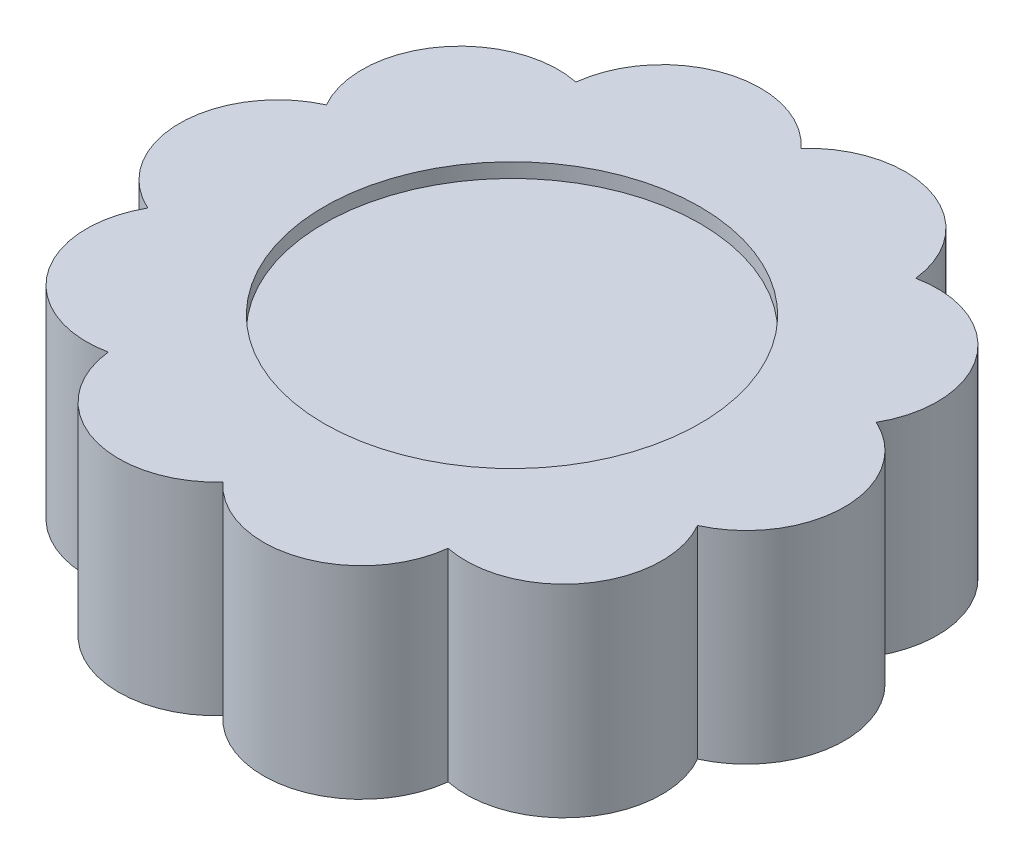
ISO-10303-21;
HEADER;
FILE_DESCRIPTION(('STEP AP214'),'2;1');
FILE_NAME('part.step','',(''),(''),'','','');
FILE_SCHEMA(('AUTOMOTIVE_DESIGN { 1 0 10303 214 1 1 1 1 }'));
ENDSEC;
DATA;
#1=APPLICATION_CONTEXT('core data for automotive mechanical design processes');
#2=APPLICATION_PROTOCOL_DEFINITION('international standard','automotive_design',2000,#1);
#3=PRODUCT_CONTEXT('',#1,'mechanical');
#4=PRODUCT('Part','Part','',(#3));
#5=PRODUCT_RELATED_PRODUCT_CATEGORY('part','',(#4));
#6=PRODUCT_DEFINITION_FORMATION('','',#4);
#7=PRODUCT_DEFINITION_CONTEXT('part definition',#1,'design');
#8=PRODUCT_DEFINITION('design','',#6,#7);
#9=PRODUCT_DEFINITION_SHAPE('','',#8);
#10=(LENGTH_UNIT() NAMED_UNIT(*) SI_UNIT(.MILLI.,.METRE.));
#11=(NAMED_UNIT(*) PLANE_ANGLE_UNIT() SI_UNIT($,.RADIAN.));
#12=(NAMED_UNIT(*) SI_UNIT($,.STERADIAN.) SOLID_ANGLE_UNIT());
#13=UNCERTAINTY_MEASURE_WITH_UNIT(LENGTH_MEASURE(1.E-05),#10,'distance_accuracy_value','');
#14=(GEOMETRIC_REPRESENTATION_CONTEXT(3) GLOBAL_UNCERTAINTY_ASSIGNED_CONTEXT((#13)) GLOBAL_UNIT_ASSIGNED_CONTEXT((#10,
#11,#12)) REPRESENTATION_CONTEXT('',''));
#15=CARTESIAN_POINT('',(0.,0.,0.));
#16=DIRECTION('',(0.,0.,1.));
#17=DIRECTION('',(1.,0.,0.));
#18=AXIS2_PLACEMENT_3D('',#15,#16,#17);
#19=CARTESIAN_POINT('',(0.,20.6421356237309,0.));
#20=DIRECTION('',(0.,-1.,0.));
#21=DIRECTION('',(0.,0.,-1.));
#22=AXIS2_PLACEMENT_3D('',#19,#20,#21);
#23=CYLINDRICAL_SURFACE('',#22,5.);
#24=CARTESIAN_POINT('',(0.,-3.,0.));
#25=DIRECTION('',(0.,-1.,0.));
#26=DIRECTION('',(0.,0.,-1.));
#27=AXIS2_PLACEMENT_3D('',#24,#25,#26);
#28=CIRCLE('',#27,5.);
#29=CARTESIAN_POINT('',(0.,-3.,-5.));
#30=VERTEX_POINT('',#29);
#31=EDGE_CURVE('E260',#30,#30,#28,.T.);
#32=ORIENTED_EDGE('',*,*,#31,.F.);
#33=EDGE_LOOP('',(#32));
#34=FACE_BOUND('',#33,.T.);
#35=CARTESIAN_POINT('',(0.,0.5,0.));
#36=DIRECTION('',(0.,1.,0.));
#37=DIRECTION('',(0.,0.,1.));
#38=AXIS2_PLACEMENT_3D('',#35,#36,#37);
#39=CIRCLE('',#38,5.);
#40=CARTESIAN_POINT('',(0.,0.5,5.));
#41=VERTEX_POINT('',#40);
#42=EDGE_CURVE('E12',#41,#41,#39,.T.);
#43=ORIENTED_EDGE('',*,*,#42,.F.);
#44=EDGE_LOOP('',(#43));
#45=FACE_BOUND('',#44,.T.);
#46=ADVANCED_FACE('F110',(#34,#45),#23,.T.);
#47=CARTESIAN_POINT('',(0.,0.,0.));
#48=DIRECTION('',(0.,1.,0.));
#49=DIRECTION('',(0.,0.,1.));
#50=AXIS2_PLACEMENT_3D('',#47,#48,#49);
#51=PLANE('',#50);
#52=DIRECTION('',(0.,0.,1.));
#53=VECTOR('',#52,1.);
#54=CARTESIAN_POINT('',(-1.6,0.,-2.65518360947035));
#55=LINE('',#54,#53);
#56=CARTESIAN_POINT('',(-1.6,0.,-2.65518360947035));
#57=VERTEX_POINT('',#56);
#58=CARTESIAN_POINT('',(-1.6,0.,2.65518360947035));
#59=VERTEX_POINT('',#58);
#60=EDGE_CURVE('E268',#57,#59,#55,.T.);
#61=ORIENTED_EDGE('',*,*,#60,.T.);
#62=CARTESIAN_POINT('',(0.,0.,0.));
#63=DIRECTION('',(0.,1.,0.));
#64=DIRECTION('',(0.,0.,1.));
#65=AXIS2_PLACEMENT_3D('',#62,#63,#64);
#66=CIRCLE('',#65,3.1);
#67=EDGE_CURVE('E271',#59,#57,#66,.T.);
#68=ORIENTED_EDGE('',*,*,#67,.T.);
#69=EDGE_LOOP('',(#61,#68));
#70=FACE_BOUND('',#69,.T.);
#71=CARTESIAN_POINT('',(0.,0.,0.));
#72=DIRECTION('',(0.,-1.,0.));
#73=DIRECTION('',(0.,0.,-1.));
#74=AXIS2_PLACEMENT_3D('',#71,#72,#73);
#75=CIRCLE('',#74,4.);
#76=CARTESIAN_POINT('',(0.,0.,-4.));
#77=VERTEX_POINT('',#76);
#78=EDGE_CURVE('E252',#77,#77,#75,.T.);
#79=ORIENTED_EDGE('',*,*,#78,.T.);
#80=EDGE_LOOP('',(#79));
#81=FACE_BOUND('',#80,.T.);
#82=ADVANCED_FACE('F289',(#70,#81),#51,.F.);
#83=CARTESIAN_POINT('',(0.,20.6421356237309,0.));
#84=DIRECTION('',(0.,-1.,0.));
#85=DIRECTION('',(0.,0.,-1.));
#86=AXIS2_PLACEMENT_3D('',#83,#84,#85);
#87=CYLINDRICAL_SURFACE('',#86,3.1);
#88=DIRECTION('',(0.,-1.,0.));
#89=VECTOR('',#88,1.);
#90=CARTESIAN_POINT('',(-1.6,20.6421356237309,2.65518360947035));
#91=LINE('',#90,#89);
#92=CARTESIAN_POINT('',(-1.6,6.5,2.65518360947035));
#93=VERTEX_POINT('',#92);
#94=EDGE_CURVE('E274',#93,#59,#91,.T.);
#95=ORIENTED_EDGE('',*,*,#94,.F.);
#96=CARTESIAN_POINT('',(0.,6.5,0.));
#97=DIRECTION('',(0.,1.,0.));
#98=DIRECTION('',(0.,0.,1.));
#99=AXIS2_PLACEMENT_3D('',#96,#97,#98);
#100=CIRCLE('',#99,3.1);
#101=CARTESIAN_POINT('',(-1.6,6.5,-2.65518360947035));
#102=VERTEX_POINT('',#101);
#103=EDGE_CURVE('E117',#93,#102,#100,.T.);
#104=ORIENTED_EDGE('',*,*,#103,.T.);
#105=DIRECTION('',(0.,-1.,0.));
#106=VECTOR('',#105,1.);
#107=CARTESIAN_POINT('',(-1.6,20.6421356237309,-2.65518360947035));
#108=LINE('',#107,#106);
#109=EDGE_CURVE('E276',#102,#57,#108,.T.);
#110=ORIENTED_EDGE('',*,*,#109,.T.);
#111=ORIENTED_EDGE('',*,*,#67,.F.);
#112=EDGE_LOOP('',(#95,#104,#110,#111));
#113=FACE_BOUND('',#112,.T.);
#114=ADVANCED_FACE('F280',(#113),#87,.F.);
#115=CARTESIAN_POINT('',(-1.6,20.6421356237309,-2.65518360947035));
#116=DIRECTION('',(1.,0.,0.));
#117=DIRECTION('',(0.,0.,-1.));
#118=AXIS2_PLACEMENT_3D('',#115,#116,#117);
#119=PLANE('',#118);
#120=ORIENTED_EDGE('',*,*,#109,.F.);
#121=DIRECTION('',(0.,0.,1.));
#122=VECTOR('',#121,1.);
#123=CARTESIAN_POINT('',(-1.6,6.5,-2.65518360947035));
#124=LINE('',#123,#122);
#125=EDGE_CURVE('E265',#102,#93,#124,.T.);
#126=ORIENTED_EDGE('',*,*,#125,.T.);
#127=ORIENTED_EDGE('',*,*,#94,.T.);
#128=ORIENTED_EDGE('',*,*,#60,.F.);
#129=EDGE_LOOP('',(#120,#126,#127,#128));
#130=FACE_BOUND('',#129,.T.);
#131=ADVANCED_FACE('F287',(#130),#119,.T.);
#132=CARTESIAN_POINT('',(0.,-3.,0.));
#133=DIRECTION('',(0.,-1.,0.));
#134=DIRECTION('',(0.,0.,-1.));
#135=AXIS2_PLACEMENT_3D('',#132,#133,#134);
#136=PLANE('',#135);
#137=ORIENTED_EDGE('',*,*,#31,.T.);
#138=EDGE_LOOP('',(#137));
#139=FACE_BOUND('',#138,.T.);
#140=CARTESIAN_POINT('',(0.,-3.,0.));
#141=DIRECTION('',(0.,-1.,0.));
#142=DIRECTION('',(0.,0.,-1.));
#143=AXIS2_PLACEMENT_3D('',#140,#141,#142);
#144=CIRCLE('',#143,4.);
#145=CARTESIAN_POINT('',(0.,-3.,-4.));
#146=VERTEX_POINT('',#145);
#147=EDGE_CURVE('E257',#146,#146,#144,.T.);
#148=ORIENTED_EDGE('',*,*,#147,.F.);
#149=EDGE_LOOP('',(#148));
#150=FACE_BOUND('',#149,.T.);
#151=ADVANCED_FACE('F296',(#139,#150),#136,.T.);
#152=CARTESIAN_POINT('',(0.,-3.,0.));
#153=DIRECTION('',(0.,1.,0.));
#154=DIRECTION('',(0.,0.,1.));
#155=AXIS2_PLACEMENT_3D('',#152,#153,#154);
#156=CYLINDRICAL_SURFACE('',#155,4.);
#157=ORIENTED_EDGE('',*,*,#147,.T.);
#158=EDGE_LOOP('',(#157));
#159=FACE_BOUND('',#158,.T.);
#160=ORIENTED_EDGE('',*,*,#78,.F.);
#161=EDGE_LOOP('',(#160));
#162=FACE_BOUND('',#161,.T.);
#163=ADVANCED_FACE('F294',(#159,#162),#156,.F.);
#164=CARTESIAN_POINT('',(0.,6.5,0.));
#165=DIRECTION('',(0.,1.,0.));
#166=DIRECTION('',(0.,0.,1.));
#167=AXIS2_PLACEMENT_3D('',#164,#165,#166);
#168=PLANE('',#167);
#169=ORIENTED_EDGE('',*,*,#125,.F.);
#170=ORIENTED_EDGE('',*,*,#103,.F.);
#171=EDGE_LOOP('',(#169,#170));
#172=FACE_BOUND('',#171,.T.);
#173=ADVANCED_FACE('F285',(#172),#168,.F.);
#174=CARTESIAN_POINT('',(0.,0.499999999999999,0.));
#175=DIRECTION('',(0.,1.,0.));
#176=DIRECTION('',(0.,0.,1.));
#177=AXIS2_PLACEMENT_3D('',#174,#175,#176);
#178=PLANE('',#177);
#179=ORIENTED_EDGE('',*,*,#42,.T.);
#180=EDGE_LOOP('',(#179));
#181=FACE_BOUND('',#180,.T.);
#182=CARTESIAN_POINT('',(-6.55733919765978,0.499999999999999,4.76418580125281));
#183=DIRECTION('',(0.,1.,0.));
#184=DIRECTION('',(0.,0.,1.));
#185=AXIS2_PLACEMENT_3D('',#182,#183,#184);
#186=CIRCLE('',#185,3.39468299805465);
#187=CARTESIAN_POINT('',(-9.51056516073295,0.499999999999999,3.09016995057758));
#188=VERTEX_POINT('',#187);
#189=CARTESIAN_POINT('',(-5.87785251711638,0.499999999999999,8.09016994796949));
#190=VERTEX_POINT('',#189);
#191=EDGE_CURVE('E218',#188,#190,#186,.T.);
#192=ORIENTED_EDGE('',*,*,#191,.F.);
#193=CARTESIAN_POINT('',(-8.10531700194535,0.499999999999999,2.90956408272036E-09));
#194=DIRECTION('',(0.,1.,0.));
#195=DIRECTION('',(0.,0.,1.));
#196=AXIS2_PLACEMENT_3D('',#193,#194,#195);
#197=CIRCLE('',#196,3.39468299805465);
#198=CARTESIAN_POINT('',(-9.51056516517012,0.499999999999999,-3.09016993692137));
#199=VERTEX_POINT('',#198);
#200=EDGE_CURVE('E211',#199,#188,#197,.T.);
#201=ORIENTED_EDGE('',*,*,#200,.F.);
#202=CARTESIAN_POINT('',(-6.55733920108017,0.499999999999999,-4.76418579654504));
#203=DIRECTION('',(0.,1.,0.));
#204=DIRECTION('',(0.,0.,1.));
#205=AXIS2_PLACEMENT_3D('',#202,#203,#204);
#206=CIRCLE('',#205,3.39468299805465);
#207=CARTESIAN_POINT('',(-5.87785252873305,0.499999999999999,-8.09016993952948));
#208=VERTEX_POINT('',#207);
#209=EDGE_CURVE('E210',#208,#199,#206,.T.);
#210=ORIENTED_EDGE('',*,*,#209,.F.);
#211=CARTESIAN_POINT('',(-2.50468070116444,0.499999999999999,-7.70861455043892));
#212=DIRECTION('',(0.,1.,0.));
#213=DIRECTION('',(0.,0.,1.));
#214=AXIS2_PLACEMENT_3D('',#211,#212,#213);
#215=CIRCLE('',#214,3.39468299805465);
#216=CARTESIAN_POINT('',(0.,0.499999999999999,-10.));
#217=VERTEX_POINT('',#216);
#218=EDGE_CURVE('E332',#217,#208,#215,.T.);
#219=ORIENTED_EDGE('',*,*,#218,.F.);
#220=CARTESIAN_POINT('',(2.50468069563008,0.499999999999999,-7.70861455223715));
#221=DIRECTION('',(0.,1.,0.));
#222=DIRECTION('',(0.,0.,1.));
#223=AXIS2_PLACEMENT_3D('',#220,#221,#222);
#224=CIRCLE('',#223,3.39468299805465);
#225=CARTESIAN_POINT('',(5.87785251711632,0.499999999999999,-8.09016994796953));
#226=VERTEX_POINT('',#225);
#227=EDGE_CURVE('E336',#226,#217,#224,.T.);
#228=ORIENTED_EDGE('',*,*,#227,.F.);
#229=CARTESIAN_POINT('',(6.55733919765975,0.499999999999999,-4.76418580125286));
#230=DIRECTION('',(0.,1.,0.));
#231=DIRECTION('',(0.,0.,1.));
#232=AXIS2_PLACEMENT_3D('',#229,#230,#231);
#233=CIRCLE('',#232,3.39468299805465);
#234=CARTESIAN_POINT('',(9.51056516073293,0.499999999999999,-3.09016995057765));
#235=VERTEX_POINT('',#234);
#236=EDGE_CURVE('E340',#235,#226,#233,.T.);
#237=ORIENTED_EDGE('',*,*,#236,.F.);
#238=CARTESIAN_POINT('',(8.10531700194535,0.499999999999999,-2.90961829282899E-09));
#239=DIRECTION('',(0.,1.,0.));
#240=DIRECTION('',(0.,0.,1.));
#241=AXIS2_PLACEMENT_3D('',#238,#239,#240);
#242=CIRCLE('',#241,3.39468299805465);
#243=CARTESIAN_POINT('',(9.51056516517014,0.499999999999999,3.09016993692131));
#244=VERTEX_POINT('',#243);
#245=EDGE_CURVE('E253',#244,#235,#242,.T.);
#246=ORIENTED_EDGE('',*,*,#245,.F.);
#247=CARTESIAN_POINT('',(6.55733920108021,0.499999999999999,4.764185796545));
#248=DIRECTION('',(0.,1.,0.));
#249=DIRECTION('',(0.,0.,1.));
#250=AXIS2_PLACEMENT_3D('',#247,#248,#249);
#251=CIRCLE('',#250,3.39468299805465);
#252=CARTESIAN_POINT('',(5.87785252873311,0.499999999999999,8.09016993952944));
#253=VERTEX_POINT('',#252);
#254=EDGE_CURVE('E240',#253,#244,#251,.T.);
#255=ORIENTED_EDGE('',*,*,#254,.F.);
#256=CARTESIAN_POINT('',(2.5046807011645,0.499999999999999,7.70861455043891));
#257=DIRECTION('',(0.,1.,0.));
#258=DIRECTION('',(0.,0.,1.));
#259=AXIS2_PLACEMENT_3D('',#256,#257,#258);
#260=CIRCLE('',#259,3.39468299805465);
#261=CARTESIAN_POINT('',(7.17953127504778E-09,0.499999999999999,10.));
#262=VERTEX_POINT('',#261);
#263=EDGE_CURVE('E129',#262,#253,#260,.T.);
#264=ORIENTED_EDGE('',*,*,#263,.F.);
#265=CARTESIAN_POINT('',(-2.50468069563013,0.499999999999999,7.70861455223713));
#266=DIRECTION('',(0.,1.,0.));
#267=DIRECTION('',(0.,0.,1.));
#268=AXIS2_PLACEMENT_3D('',#265,#266,#267);
#269=CIRCLE('',#268,3.39468299805465);
#270=EDGE_CURVE('E124',#190,#262,#269,.T.);
#271=ORIENTED_EDGE('',*,*,#270,.F.);
#272=EDGE_LOOP('',(#192,#201,#210,#219,#228,#237,#246,#255,#264,#271));
#273=FACE_BOUND('',#272,.T.);
#274=ADVANCED_FACE('F303',(#181,#273),#178,.F.);
#275=CARTESIAN_POINT('',(0.,7.5,0.));
#276=DIRECTION('',(0.,1.,0.));
#277=DIRECTION('',(0.,0.,1.));
#278=AXIS2_PLACEMENT_3D('',#275,#276,#277);
#279=PLANE('',#278);
#280=CARTESIAN_POINT('',(0.,7.5,0.));
#281=DIRECTION('',(0.,1.,0.));
#282=DIRECTION('',(0.,0.,1.));
#283=AXIS2_PLACEMENT_3D('',#280,#281,#282);
#284=CIRCLE('',#283,6.5);
#285=CARTESIAN_POINT('',(0.,7.5,6.5));
#286=VERTEX_POINT('',#285);
#287=EDGE_CURVE('E368',#286,#286,#284,.T.);
#288=ORIENTED_EDGE('',*,*,#287,.F.);
#289=EDGE_LOOP('',(#288));
#290=FACE_BOUND('',#289,.T.);
#291=CARTESIAN_POINT('',(8.10531700194535,7.5,-2.90961829282899E-09));
#292=DIRECTION('',(0.,1.,0.));
#293=DIRECTION('',(0.,0.,1.));
#294=AXIS2_PLACEMENT_3D('',#291,#292,#293);
#295=CIRCLE('',#294,3.39468299805465);
#296=CARTESIAN_POINT('',(9.51056516295155,7.5,-3.09016994374945));
#297=VERTEX_POINT('',#296);
#298=CARTESIAN_POINT('',(9.51056516517014,7.5,3.09016993692131));
#299=VERTEX_POINT('',#298);
#300=EDGE_CURVE('E248',#297,#299,#295,.F.);
#301=ORIENTED_EDGE('',*,*,#300,.F.);
#302=CARTESIAN_POINT('',(6.55733919765975,7.5,-4.76418580125286));
#303=DIRECTION('',(0.,1.,0.));
#304=DIRECTION('',(0.,0.,1.));
#305=AXIS2_PLACEMENT_3D('',#302,#303,#304);
#306=CIRCLE('',#305,3.39468299805465);
#307=CARTESIAN_POINT('',(5.87785251711632,7.5,-8.09016994796953));
#308=VERTEX_POINT('',#307);
#309=EDGE_CURVE('E219',#308,#297,#306,.F.);
#310=ORIENTED_EDGE('',*,*,#309,.F.);
#311=CARTESIAN_POINT('',(2.50468069563008,7.5,-7.70861455223715));
#312=DIRECTION('',(0.,-1.,0.));
#313=DIRECTION('',(0.,0.,-1.));
#314=AXIS2_PLACEMENT_3D('',#311,#312,#313);
#315=CIRCLE('',#314,3.39468299805465);
#316=CARTESIAN_POINT('',(0.,7.5,-10.));
#317=VERTEX_POINT('',#316);
#318=EDGE_CURVE('E341',#317,#308,#315,.T.);
#319=ORIENTED_EDGE('',*,*,#318,.F.);
#320=CARTESIAN_POINT('',(-2.50468070116444,7.5,-7.70861455043892));
#321=DIRECTION('',(0.,1.,0.));
#322=DIRECTION('',(0.,0.,1.));
#323=AXIS2_PLACEMENT_3D('',#320,#321,#322);
#324=CIRCLE('',#323,3.39468299805465);
#325=CARTESIAN_POINT('',(-5.87785252873305,7.5,-8.09016993952948));
#326=VERTEX_POINT('',#325);
#327=EDGE_CURVE('E334',#326,#317,#324,.F.);
#328=ORIENTED_EDGE('',*,*,#327,.F.);
#329=CARTESIAN_POINT('',(-6.55733920108017,7.5,-4.76418579654504));
#330=DIRECTION('',(0.,-1.,0.));
#331=DIRECTION('',(0.,0.,-1.));
#332=AXIS2_PLACEMENT_3D('',#329,#330,#331);
#333=CIRCLE('',#332,3.39468299805465);
#334=CARTESIAN_POINT('',(-9.51056516517012,7.5,-3.09016993692137));
#335=VERTEX_POINT('',#334);
#336=EDGE_CURVE('E206',#335,#326,#333,.T.);
#337=ORIENTED_EDGE('',*,*,#336,.F.);
#338=CARTESIAN_POINT('',(-8.10531700194535,7.5,2.90956408272036E-09));
#339=DIRECTION('',(0.,1.,0.));
#340=DIRECTION('',(0.,0.,1.));
#341=AXIS2_PLACEMENT_3D('',#338,#339,#340);
#342=CIRCLE('',#341,3.39468299805465);
#343=CARTESIAN_POINT('',(-9.51056516073295,7.5,3.09016995057758));
#344=VERTEX_POINT('',#343);
#345=EDGE_CURVE('E198',#344,#335,#342,.F.);
#346=ORIENTED_EDGE('',*,*,#345,.F.);
#347=CARTESIAN_POINT('',(-6.55733919765978,7.5,4.76418580125281));
#348=DIRECTION('',(0.,1.,0.));
#349=DIRECTION('',(0.,0.,1.));
#350=AXIS2_PLACEMENT_3D('',#347,#348,#349);
#351=CIRCLE('',#350,3.39468299805465);
#352=CARTESIAN_POINT('',(-5.87785251711638,7.5,8.09016994796949));
#353=VERTEX_POINT('',#352);
#354=EDGE_CURVE('E204',#353,#344,#351,.F.);
#355=ORIENTED_EDGE('',*,*,#354,.F.);
#356=CARTESIAN_POINT('',(-2.50468069563013,7.5,7.70861455223713));
#357=DIRECTION('',(0.,1.,0.));
#358=DIRECTION('',(0.,0.,1.));
#359=AXIS2_PLACEMENT_3D('',#356,#357,#358);
#360=CIRCLE('',#359,3.39468299805465);
#361=CARTESIAN_POINT('',(7.17953127504778E-09,7.5,10.));
#362=VERTEX_POINT('',#361);
#363=EDGE_CURVE('E231',#362,#353,#360,.F.);
#364=ORIENTED_EDGE('',*,*,#363,.F.);
#365=CARTESIAN_POINT('',(2.5046807011645,7.5,7.70861455043891));
#366=DIRECTION('',(0.,1.,0.));
#367=DIRECTION('',(0.,0.,1.));
#368=AXIS2_PLACEMENT_3D('',#365,#366,#367);
#369=CIRCLE('',#368,3.39468299805465);
#370=CARTESIAN_POINT('',(5.87785252873311,7.5,8.09016993952944));
#371=VERTEX_POINT('',#370);
#372=EDGE_CURVE('E237',#371,#362,#369,.F.);
#373=ORIENTED_EDGE('',*,*,#372,.F.);
#374=CARTESIAN_POINT('',(6.55733920108021,7.5,4.764185796545));
#375=DIRECTION('',(0.,1.,0.));
#376=DIRECTION('',(0.,0.,1.));
#377=AXIS2_PLACEMENT_3D('',#374,#375,#376);
#378=CIRCLE('',#377,3.39468299805465);
#379=EDGE_CURVE('E244',#299,#371,#378,.F.);
#380=ORIENTED_EDGE('',*,*,#379,.F.);
#381=EDGE_LOOP('',(#301,#310,#319,#328,#337,#346,#355,#364,#373,#380));
#382=FACE_BOUND('',#381,.T.);
#383=ADVANCED_FACE('F201',(#290,#382),#279,.T.);
#384=CARTESIAN_POINT('',(8.10531700194535,-6.10515619326562,-2.90961829282899E-09));
#385=DIRECTION('',(0.,1.,0.));
#386=DIRECTION('',(0.,0.,1.));
#387=AXIS2_PLACEMENT_3D('',#384,#385,#386);
#388=CYLINDRICAL_SURFACE('',#387,3.39468299805465);
#389=DIRECTION('',(0.,1.,0.));
#390=VECTOR('',#389,1.);
#391=CARTESIAN_POINT('',(9.51056516517014,-6.10515619326562,3.09016993692131));
#392=LINE('',#391,#390);
#393=EDGE_CURVE('E241',#244,#299,#392,.T.);
#394=ORIENTED_EDGE('',*,*,#393,.F.);
#395=ORIENTED_EDGE('',*,*,#245,.T.);
#396=DIRECTION('',(0.,1.,0.));
#397=VECTOR('',#396,1.);
#398=CARTESIAN_POINT('',(9.51056516073293,-6.10515619326562,-3.09016995057765));
#399=LINE('',#398,#397);
#400=EDGE_CURVE('E249',#235,#297,#399,.T.);
#401=ORIENTED_EDGE('',*,*,#400,.T.);
#402=ORIENTED_EDGE('',*,*,#300,.T.);
#403=EDGE_LOOP('',(#394,#395,#401,#402));
#404=FACE_BOUND('',#403,.T.);
#405=ADVANCED_FACE('F359',(#404),#388,.T.);
#406=CARTESIAN_POINT('',(6.55733920108021,-6.10515619326562,4.764185796545));
#407=DIRECTION('',(0.,1.,0.));
#408=DIRECTION('',(0.,0.,1.));
#409=AXIS2_PLACEMENT_3D('',#406,#407,#408);
#410=CYLINDRICAL_SURFACE('',#409,3.39468299805465);
#411=DIRECTION('',(0.,1.,0.));
#412=VECTOR('',#411,1.);
#413=CARTESIAN_POINT('',(5.87785252873311,-6.10515619326562,8.09016993952944));
#414=LINE('',#413,#412);
#415=EDGE_CURVE('E234',#253,#371,#414,.T.);
#416=ORIENTED_EDGE('',*,*,#415,.F.);
#417=ORIENTED_EDGE('',*,*,#254,.T.);
#418=ORIENTED_EDGE('',*,*,#393,.T.);
#419=ORIENTED_EDGE('',*,*,#379,.T.);
#420=EDGE_LOOP('',(#416,#417,#418,#419));
#421=FACE_BOUND('',#420,.T.);
#422=ADVANCED_FACE('F387',(#421),#410,.T.);
#423=CARTESIAN_POINT('',(2.5046807011645,-6.10515619326562,7.70861455043891));
#424=DIRECTION('',(0.,1.,0.));
#425=DIRECTION('',(0.,0.,1.));
#426=AXIS2_PLACEMENT_3D('',#423,#424,#425);
#427=CYLINDRICAL_SURFACE('',#426,3.39468299805465);
#428=DIRECTION('',(0.,1.,0.));
#429=VECTOR('',#428,1.);
#430=CARTESIAN_POINT('',(7.17953127504778E-09,-6.10515619326562,10.));
#431=LINE('',#430,#429);
#432=EDGE_CURVE('E225',#262,#362,#431,.T.);
#433=ORIENTED_EDGE('',*,*,#432,.F.);
#434=ORIENTED_EDGE('',*,*,#263,.T.);
#435=ORIENTED_EDGE('',*,*,#415,.T.);
#436=ORIENTED_EDGE('',*,*,#372,.T.);
#437=EDGE_LOOP('',(#433,#434,#435,#436));
#438=FACE_BOUND('',#437,.T.);
#439=ADVANCED_FACE('F392',(#438),#427,.T.);
#440=CARTESIAN_POINT('',(-2.50468069563013,-6.10515619326562,7.70861455223713));
#441=DIRECTION('',(0.,1.,0.));
#442=DIRECTION('',(0.,0.,1.));
#443=AXIS2_PLACEMENT_3D('',#440,#441,#442);
#444=CYLINDRICAL_SURFACE('',#443,3.39468299805465);
#445=DIRECTION('',(0.,1.,0.));
#446=VECTOR('',#445,1.);
#447=CARTESIAN_POINT('',(-5.87785251711638,-6.10515619326562,8.09016994796949));
#448=LINE('',#447,#446);
#449=EDGE_CURVE('E223',#190,#353,#448,.T.);
#450=ORIENTED_EDGE('',*,*,#449,.F.);
#451=ORIENTED_EDGE('',*,*,#270,.T.);
#452=ORIENTED_EDGE('',*,*,#432,.T.);
#453=ORIENTED_EDGE('',*,*,#363,.T.);
#454=EDGE_LOOP('',(#450,#451,#452,#453));
#455=FACE_BOUND('',#454,.T.);
#456=ADVANCED_FACE('F396',(#455),#444,.T.);
#457=CARTESIAN_POINT('',(-6.55733919765978,-6.10515619326562,4.76418580125281));
#458=DIRECTION('',(0.,1.,0.));
#459=DIRECTION('',(0.,0.,1.));
#460=AXIS2_PLACEMENT_3D('',#457,#458,#459);
#461=CYLINDRICAL_SURFACE('',#460,3.39468299805465);
#462=DIRECTION('',(0.,1.,0.));
#463=VECTOR('',#462,1.);
#464=CARTESIAN_POINT('',(-9.51056516073295,-6.10515619326562,3.09016995057758));
#465=LINE('',#464,#463);
#466=EDGE_CURVE('E214',#188,#344,#465,.T.);
#467=ORIENTED_EDGE('',*,*,#466,.F.);
#468=ORIENTED_EDGE('',*,*,#191,.T.);
#469=ORIENTED_EDGE('',*,*,#449,.T.);
#470=ORIENTED_EDGE('',*,*,#354,.T.);
#471=EDGE_LOOP('',(#467,#468,#469,#470));
#472=FACE_BOUND('',#471,.T.);
#473=ADVANCED_FACE('F222',(#472),#461,.T.);
#474=CARTESIAN_POINT('',(6.55733919765975,-6.10515619326562,-4.76418580125286));
#475=DIRECTION('',(0.,1.,0.));
#476=DIRECTION('',(0.,0.,1.));
#477=AXIS2_PLACEMENT_3D('',#474,#475,#476);
#478=CYLINDRICAL_SURFACE('',#477,3.39468299805465);
#479=ORIENTED_EDGE('',*,*,#400,.F.);
#480=ORIENTED_EDGE('',*,*,#236,.T.);
#481=DIRECTION('',(0.,1.,0.));
#482=VECTOR('',#481,1.);
#483=CARTESIAN_POINT('',(5.87785251711632,-6.10515619326562,-8.09016994796953));
#484=LINE('',#483,#482);
#485=EDGE_CURVE('E337',#226,#308,#484,.T.);
#486=ORIENTED_EDGE('',*,*,#485,.T.);
#487=ORIENTED_EDGE('',*,*,#309,.T.);
#488=EDGE_LOOP('',(#479,#480,#486,#487));
#489=FACE_BOUND('',#488,.T.);
#490=ADVANCED_FACE('F353',(#489),#478,.T.);
#491=CARTESIAN_POINT('',(2.50468069563008,-6.10515619326562,-7.70861455223715));
#492=DIRECTION('',(0.,1.,0.));
#493=DIRECTION('',(0.,0.,1.));
#494=AXIS2_PLACEMENT_3D('',#491,#492,#493);
#495=CYLINDRICAL_SURFACE('',#494,3.39468299805465);
#496=ORIENTED_EDGE('',*,*,#485,.F.);
#497=ORIENTED_EDGE('',*,*,#227,.T.);
#498=DIRECTION('',(0.,1.,0.));
#499=VECTOR('',#498,1.);
#500=CARTESIAN_POINT('',(0.,-6.10515619326562,-10.));
#501=LINE('',#500,#499);
#502=EDGE_CURVE('E342',#217,#317,#501,.T.);
#503=ORIENTED_EDGE('',*,*,#502,.T.);
#504=ORIENTED_EDGE('',*,*,#318,.T.);
#505=EDGE_LOOP('',(#496,#497,#503,#504));
#506=FACE_BOUND('',#505,.T.);
#507=ADVANCED_FACE('F364',(#506),#495,.T.);
#508=CARTESIAN_POINT('',(-2.50468070116444,-6.10515619326562,-7.70861455043892));
#509=DIRECTION('',(0.,1.,0.));
#510=DIRECTION('',(0.,0.,1.));
#511=AXIS2_PLACEMENT_3D('',#508,#509,#510);
#512=CYLINDRICAL_SURFACE('',#511,3.39468299805465);
#513=ORIENTED_EDGE('',*,*,#502,.F.);
#514=ORIENTED_EDGE('',*,*,#218,.T.);
#515=DIRECTION('',(0.,1.,0.));
#516=VECTOR('',#515,1.);
#517=CARTESIAN_POINT('',(-5.87785252873305,-6.10515619326562,-8.09016993952948));
#518=LINE('',#517,#516);
#519=EDGE_CURVE('E327',#208,#326,#518,.T.);
#520=ORIENTED_EDGE('',*,*,#519,.T.);
#521=ORIENTED_EDGE('',*,*,#327,.T.);
#522=EDGE_LOOP('',(#513,#514,#520,#521));
#523=FACE_BOUND('',#522,.T.);
#524=ADVANCED_FACE('F366',(#523),#512,.T.);
#525=CARTESIAN_POINT('',(-6.55733920108017,-6.10515619326562,-4.76418579654504));
#526=DIRECTION('',(0.,1.,0.));
#527=DIRECTION('',(0.,0.,1.));
#528=AXIS2_PLACEMENT_3D('',#525,#526,#527);
#529=CYLINDRICAL_SURFACE('',#528,3.39468299805465);
#530=ORIENTED_EDGE('',*,*,#519,.F.);
#531=ORIENTED_EDGE('',*,*,#209,.T.);
#532=DIRECTION('',(0.,1.,0.));
#533=VECTOR('',#532,1.);
#534=CARTESIAN_POINT('',(-9.51056516517012,-6.10515619326562,-3.09016993692137));
#535=LINE('',#534,#533);
#536=EDGE_CURVE('E322',#199,#335,#535,.T.);
#537=ORIENTED_EDGE('',*,*,#536,.T.);
#538=ORIENTED_EDGE('',*,*,#336,.T.);
#539=EDGE_LOOP('',(#530,#531,#537,#538));
#540=FACE_BOUND('',#539,.T.);
#541=ADVANCED_FACE('F325',(#540),#529,.T.);
#542=CARTESIAN_POINT('',(-8.10531700194535,-6.10515619326562,2.90956408272036E-09));
#543=DIRECTION('',(0.,1.,0.));
#544=DIRECTION('',(0.,0.,1.));
#545=AXIS2_PLACEMENT_3D('',#542,#543,#544);
#546=CYLINDRICAL_SURFACE('',#545,3.39468299805465);
#547=ORIENTED_EDGE('',*,*,#536,.F.);
#548=ORIENTED_EDGE('',*,*,#200,.T.);
#549=ORIENTED_EDGE('',*,*,#466,.T.);
#550=ORIENTED_EDGE('',*,*,#345,.T.);
#551=EDGE_LOOP('',(#547,#548,#549,#550));
#552=FACE_BOUND('',#551,.T.);
#553=ADVANCED_FACE('F215',(#552),#546,.T.);
#554=CARTESIAN_POINT('',(0.,7.,0.));
#555=DIRECTION('',(0.,1.,0.));
#556=DIRECTION('',(0.,0.,1.));
#557=AXIS2_PLACEMENT_3D('',#554,#555,#556);
#558=CYLINDRICAL_SURFACE('',#557,6.5);
#559=CARTESIAN_POINT('',(0.,7.,0.));
#560=DIRECTION('',(0.,1.,0.));
#561=DIRECTION('',(0.,0.,1.));
#562=AXIS2_PLACEMENT_3D('',#559,#560,#561);
#563=CIRCLE('',#562,6.5);
#564=CARTESIAN_POINT('',(0.,7.,6.5));
#565=VERTEX_POINT('',#564);
#566=EDGE_CURVE('E320',#565,#565,#563,.T.);
#567=ORIENTED_EDGE('',*,*,#566,.F.);
#568=EDGE_LOOP('',(#567));
#569=FACE_BOUND('',#568,.T.);
#570=ORIENTED_EDGE('',*,*,#287,.T.);
#571=EDGE_LOOP('',(#570));
#572=FACE_BOUND('',#571,.T.);
#573=ADVANCED_FACE('F376',(#569,#572),#558,.F.);
#574=CARTESIAN_POINT('',(0.,7.,0.));
#575=DIRECTION('',(0.,1.,0.));
#576=DIRECTION('',(0.,0.,1.));
#577=AXIS2_PLACEMENT_3D('',#574,#575,#576);
#578=PLANE('',#577);
#579=ORIENTED_EDGE('',*,*,#566,.T.);
#580=EDGE_LOOP('',(#579));
#581=FACE_BOUND('',#580,.T.);
#582=ADVANCED_FACE('F374',(#581),#578,.T.);
#583=CLOSED_SHELL('',(#46,#82,#114,#131,#151,#163,#173,#274,#383,#405,#422,#439,#456,#473,#490,
#507,#524,#541,#553,#573,#582));
#584=MANIFOLD_SOLID_BREP('B2',#583);
#585=ADVANCED_BREP_SHAPE_REPRESENTATION('',(#18,#584),#14);
#586=SHAPE_DEFINITION_REPRESENTATION(#9,#585);
ENDSEC;
END-ISO-10303-21;
